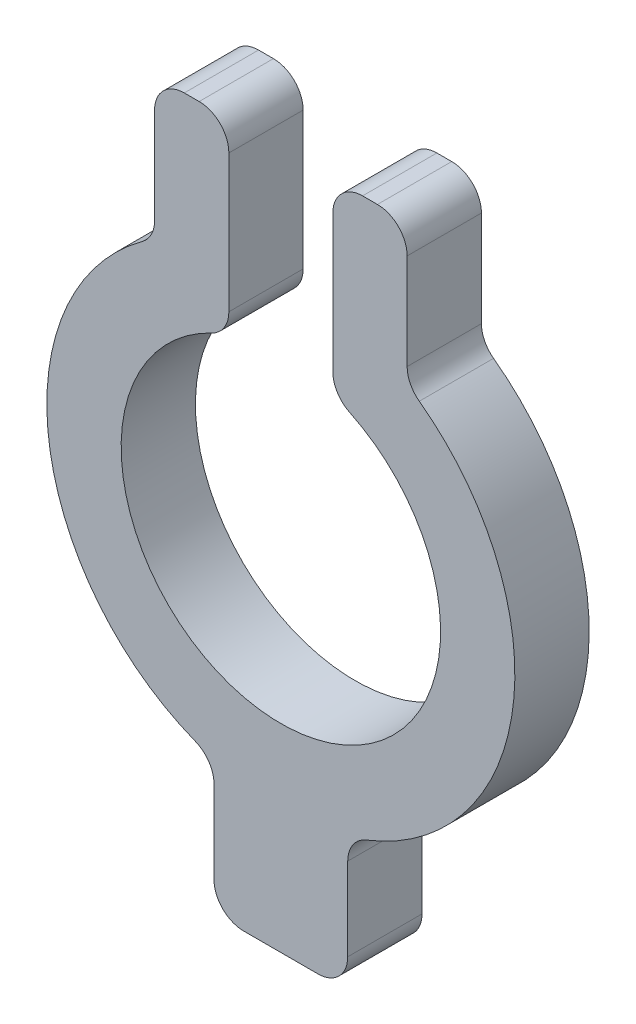
ISO-10303-21;
HEADER;
FILE_DESCRIPTION(('STEP AP214'),'2;1');
FILE_NAME('part.step','',(''),(''),'','','');
FILE_SCHEMA(('AUTOMOTIVE_DESIGN { 1 0 10303 214 1 1 1 1 }'));
ENDSEC;
DATA;
#1=APPLICATION_CONTEXT('core data for automotive mechanical design processes');
#2=APPLICATION_PROTOCOL_DEFINITION('international standard','automotive_design',2000,#1);
#3=PRODUCT_CONTEXT('',#1,'mechanical');
#4=PRODUCT('Part','Part','',(#3));
#5=PRODUCT_RELATED_PRODUCT_CATEGORY('part','',(#4));
#6=PRODUCT_DEFINITION_FORMATION('','',#4);
#7=PRODUCT_DEFINITION_CONTEXT('part definition',#1,'design');
#8=PRODUCT_DEFINITION('design','',#6,#7);
#9=PRODUCT_DEFINITION_SHAPE('','',#8);
#10=(LENGTH_UNIT() NAMED_UNIT(*) SI_UNIT(.MILLI.,.METRE.));
#11=(NAMED_UNIT(*) PLANE_ANGLE_UNIT() SI_UNIT($,.RADIAN.));
#12=(NAMED_UNIT(*) SI_UNIT($,.STERADIAN.) SOLID_ANGLE_UNIT());
#13=UNCERTAINTY_MEASURE_WITH_UNIT(LENGTH_MEASURE(1.E-05),#10,'distance_accuracy_value','');
#14=(GEOMETRIC_REPRESENTATION_CONTEXT(3) GLOBAL_UNCERTAINTY_ASSIGNED_CONTEXT((#13)) GLOBAL_UNIT_ASSIGNED_CONTEXT((#10,
#11,#12)) REPRESENTATION_CONTEXT('',''));
#15=CARTESIAN_POINT('',(0.,0.,0.));
#16=DIRECTION('',(0.,0.,1.));
#17=DIRECTION('',(1.,0.,0.));
#18=AXIS2_PLACEMENT_3D('',#15,#16,#17);
#19=CARTESIAN_POINT('',(0.,0.,5.));
#20=DIRECTION('',(0.,0.,-1.));
#21=DIRECTION('',(-1.,0.,0.));
#22=AXIS2_PLACEMENT_3D('',#19,#20,#21);
#23=CYLINDRICAL_SURFACE('',#22,15.75);
#24=CARTESIAN_POINT('',(0.,0.,5.));
#25=DIRECTION('',(0.,0.,1.));
#26=DIRECTION('',(1.,0.,0.));
#27=AXIS2_PLACEMENT_3D('',#24,#25,#26);
#28=CIRCLE('',#27,15.75);
#29=CARTESIAN_POINT('',(5.76760563380282,-14.6559621060143,5.));
#30=VERTEX_POINT('',#29);
#31=CARTESIAN_POINT('',(9.3169014084507,12.6987341158562,5.));
#32=VERTEX_POINT('',#31);
#33=EDGE_CURVE('E225',#30,#32,#28,.T.);
#34=ORIENTED_EDGE('',*,*,#33,.F.);
#35=DIRECTION('',(0.,0.,-1.));
#36=VECTOR('',#35,1.);
#37=CARTESIAN_POINT('',(5.76760563380282,-14.6559621060143,5.));
#38=LINE('',#37,#36);
#39=CARTESIAN_POINT('',(5.76760563380282,-14.6559621060143,0.));
#40=VERTEX_POINT('',#39);
#41=EDGE_CURVE('E274',#30,#40,#38,.T.);
#42=ORIENTED_EDGE('',*,*,#41,.T.);
#43=CARTESIAN_POINT('',(0.,0.,0.));
#44=DIRECTION('',(0.,0.,1.));
#45=DIRECTION('',(1.,0.,0.));
#46=AXIS2_PLACEMENT_3D('',#43,#44,#45);
#47=CIRCLE('',#46,15.75);
#48=CARTESIAN_POINT('',(9.3169014084507,12.6987341158562,0.));
#49=VERTEX_POINT('',#48);
#50=EDGE_CURVE('E359',#40,#49,#47,.T.);
#51=ORIENTED_EDGE('',*,*,#50,.T.);
#52=DIRECTION('',(0.,0.,-1.));
#53=VECTOR('',#52,1.);
#54=CARTESIAN_POINT('',(9.3169014084507,12.6987341158562,5.));
#55=LINE('',#54,#53);
#56=EDGE_CURVE('E272',#49,#32,#55,.F.);
#57=ORIENTED_EDGE('',*,*,#56,.T.);
#58=EDGE_LOOP('',(#34,#42,#51,#57));
#59=FACE_BOUND('',#58,.T.);
#60=ADVANCED_FACE('F35',(#59),#23,.T.);
#61=CARTESIAN_POINT('',(8.5,13.2594306061761,5.));
#62=DIRECTION('',(-1.,0.,0.));
#63=DIRECTION('',(0.,0.,1.));
#64=AXIS2_PLACEMENT_3D('',#61,#62,#63);
#65=PLANE('',#64);
#66=DIRECTION('',(0.,1.,0.));
#67=VECTOR('',#66,1.);
#68=CARTESIAN_POINT('',(8.5,13.2594306061761,5.));
#69=LINE('',#68,#67);
#70=CARTESIAN_POINT('',(8.5,14.3112717813617,5.));
#71=VERTEX_POINT('',#70);
#72=CARTESIAN_POINT('',(8.5,20.7594306061761,5.));
#73=VERTEX_POINT('',#72);
#74=EDGE_CURVE('E499',#71,#73,#69,.T.);
#75=ORIENTED_EDGE('',*,*,#74,.F.);
#76=DIRECTION('',(0.,0.,1.));
#77=VECTOR('',#76,1.);
#78=CARTESIAN_POINT('',(8.5,14.3112717813617,0.));
#79=LINE('',#78,#77);
#80=CARTESIAN_POINT('',(8.5,14.3112717813617,0.));
#81=VERTEX_POINT('',#80);
#82=EDGE_CURVE('E279',#71,#81,#79,.F.);
#83=ORIENTED_EDGE('',*,*,#82,.T.);
#84=DIRECTION('',(0.,1.,0.));
#85=VECTOR('',#84,1.);
#86=CARTESIAN_POINT('',(8.5,13.2594306061761,0.));
#87=LINE('',#86,#85);
#88=CARTESIAN_POINT('',(8.5,20.7594306061761,0.));
#89=VERTEX_POINT('',#88);
#90=EDGE_CURVE('E362',#81,#89,#87,.T.);
#91=ORIENTED_EDGE('',*,*,#90,.T.);
#92=DIRECTION('',(0.,0.,-1.));
#93=VECTOR('',#92,1.);
#94=CARTESIAN_POINT('',(8.5,20.7594306061761,5.));
#95=LINE('',#94,#93);
#96=EDGE_CURVE('E277',#89,#73,#95,.F.);
#97=ORIENTED_EDGE('',*,*,#96,.T.);
#98=EDGE_LOOP('',(#75,#83,#91,#97));
#99=FACE_BOUND('',#98,.T.);
#100=ADVANCED_FACE('F394',(#99),#65,.F.);
#101=CARTESIAN_POINT('',(3.5,22.7594306061761,5.));
#102=DIRECTION('',(0.,-1.,0.));
#103=DIRECTION('',(0.,0.,-1.));
#104=AXIS2_PLACEMENT_3D('',#101,#102,#103);
#105=PLANE('',#104);
#106=DIRECTION('',(-1.,0.,0.));
#107=VECTOR('',#106,1.);
#108=CARTESIAN_POINT('',(3.5,22.7594306061761,5.));
#109=LINE('',#108,#107);
#110=CARTESIAN_POINT('',(6.5,22.7594306061761,5.));
#111=VERTEX_POINT('',#110);
#112=CARTESIAN_POINT('',(5.5,22.7594306061761,5.));
#113=VERTEX_POINT('',#112);
#114=EDGE_CURVE('E464',#111,#113,#109,.T.);
#115=ORIENTED_EDGE('',*,*,#114,.F.);
#116=DIRECTION('',(0.,0.,-1.));
#117=VECTOR('',#116,1.);
#118=CARTESIAN_POINT('',(6.5,22.7594306061761,5.));
#119=LINE('',#118,#117);
#120=CARTESIAN_POINT('',(6.5,22.7594306061761,0.));
#121=VERTEX_POINT('',#120);
#122=EDGE_CURVE('E284',#111,#121,#119,.T.);
#123=ORIENTED_EDGE('',*,*,#122,.T.);
#124=DIRECTION('',(-1.,0.,0.));
#125=VECTOR('',#124,1.);
#126=CARTESIAN_POINT('',(3.5,22.7594306061761,0.));
#127=LINE('',#126,#125);
#128=CARTESIAN_POINT('',(5.5,22.7594306061761,0.));
#129=VERTEX_POINT('',#128);
#130=EDGE_CURVE('E365',#121,#129,#127,.T.);
#131=ORIENTED_EDGE('',*,*,#130,.T.);
#132=DIRECTION('',(0.,0.,-1.));
#133=VECTOR('',#132,1.);
#134=CARTESIAN_POINT('',(5.5,22.7594306061761,5.));
#135=LINE('',#134,#133);
#136=EDGE_CURVE('E282',#129,#113,#135,.F.);
#137=ORIENTED_EDGE('',*,*,#136,.T.);
#138=EDGE_LOOP('',(#115,#123,#131,#137));
#139=FACE_BOUND('',#138,.T.);
#140=ADVANCED_FACE('F400',(#139),#105,.F.);
#141=CARTESIAN_POINT('',(3.5,10.1642756751281,5.));
#142=DIRECTION('',(1.,0.,0.));
#143=DIRECTION('',(0.,1.,0.));
#144=AXIS2_PLACEMENT_3D('',#141,#142,#143);
#145=PLANE('',#144);
#146=DIRECTION('',(0.,-1.,0.));
#147=VECTOR('',#146,1.);
#148=CARTESIAN_POINT('',(3.5,10.1642756751281,5.));
#149=LINE('',#148,#147);
#150=CARTESIAN_POINT('',(3.5,20.7594306061761,5.));
#151=VERTEX_POINT('',#150);
#152=CARTESIAN_POINT('',(3.5,11.5027170703273,5.));
#153=VERTEX_POINT('',#152);
#154=EDGE_CURVE('E455',#151,#153,#149,.T.);
#155=ORIENTED_EDGE('',*,*,#154,.F.);
#156=DIRECTION('',(0.,0.,-1.));
#157=VECTOR('',#156,1.);
#158=CARTESIAN_POINT('',(3.5,20.7594306061761,5.));
#159=LINE('',#158,#157);
#160=CARTESIAN_POINT('',(3.5,20.7594306061761,0.));
#161=VERTEX_POINT('',#160);
#162=EDGE_CURVE('E289',#151,#161,#159,.T.);
#163=ORIENTED_EDGE('',*,*,#162,.T.);
#164=DIRECTION('',(0.,-1.,0.));
#165=VECTOR('',#164,1.);
#166=CARTESIAN_POINT('',(3.5,10.1642756751281,0.));
#167=LINE('',#166,#165);
#168=CARTESIAN_POINT('',(3.5,11.5027170703273,0.));
#169=VERTEX_POINT('',#168);
#170=EDGE_CURVE('E368',#161,#169,#167,.T.);
#171=ORIENTED_EDGE('',*,*,#170,.T.);
#172=DIRECTION('',(0.,0.,-1.));
#173=VECTOR('',#172,1.);
#174=CARTESIAN_POINT('',(3.5,11.5027170703273,5.));
#175=LINE('',#174,#173);
#176=EDGE_CURVE('E287',#169,#153,#175,.F.);
#177=ORIENTED_EDGE('',*,*,#176,.T.);
#178=EDGE_LOOP('',(#155,#163,#171,#177));
#179=FACE_BOUND('',#178,.T.);
#180=ADVANCED_FACE('F484',(#179),#145,.F.);
#181=CARTESIAN_POINT('',(0.,0.,5.));
#182=DIRECTION('',(0.,0.,-1.));
#183=DIRECTION('',(-1.,0.,0.));
#184=AXIS2_PLACEMENT_3D('',#181,#182,#183);
#185=CYLINDRICAL_SURFACE('',#184,10.75);
#186=CARTESIAN_POINT('',(0.,0.,5.));
#187=DIRECTION('',(0.,0.,-1.));
#188=DIRECTION('',(1.,0.,0.));
#189=AXIS2_PLACEMENT_3D('',#186,#187,#188);
#190=CIRCLE('',#189,10.75);
#191=CARTESIAN_POINT('',(4.63725490196078,9.69836929458972,5.));
#192=VERTEX_POINT('',#191);
#193=CARTESIAN_POINT('',(-4.63725490196078,9.69836929458972,5.));
#194=VERTEX_POINT('',#193);
#195=EDGE_CURVE('E452',#192,#194,#190,.T.);
#196=ORIENTED_EDGE('',*,*,#195,.F.);
#197=DIRECTION('',(0.,0.,-1.));
#198=VECTOR('',#197,1.);
#199=CARTESIAN_POINT('',(4.63725490196078,9.69836929458972,5.));
#200=LINE('',#199,#198);
#201=CARTESIAN_POINT('',(4.63725490196078,9.69836929458972,0.));
#202=VERTEX_POINT('',#201);
#203=EDGE_CURVE('E309',#192,#202,#200,.T.);
#204=ORIENTED_EDGE('',*,*,#203,.T.);
#205=CARTESIAN_POINT('',(0.,0.,0.));
#206=DIRECTION('',(0.,0.,-1.));
#207=DIRECTION('',(1.,0.,0.));
#208=AXIS2_PLACEMENT_3D('',#205,#206,#207);
#209=CIRCLE('',#208,10.75);
#210=CARTESIAN_POINT('',(-4.63725490196078,9.69836929458972,0.));
#211=VERTEX_POINT('',#210);
#212=EDGE_CURVE('E371',#202,#211,#209,.T.);
#213=ORIENTED_EDGE('',*,*,#212,.T.);
#214=DIRECTION('',(0.,0.,-1.));
#215=VECTOR('',#214,1.);
#216=CARTESIAN_POINT('',(-4.63725490196078,9.69836929458972,5.));
#217=LINE('',#216,#215);
#218=EDGE_CURVE('E307',#211,#194,#217,.F.);
#219=ORIENTED_EDGE('',*,*,#218,.T.);
#220=EDGE_LOOP('',(#196,#204,#213,#219));
#221=FACE_BOUND('',#220,.T.);
#222=ADVANCED_FACE('F457',(#221),#185,.F.);
#223=CARTESIAN_POINT('',(-3.5,10.1642756751281,5.));
#224=DIRECTION('',(-1.,0.,0.));
#225=DIRECTION('',(0.,-1.,0.));
#226=AXIS2_PLACEMENT_3D('',#223,#224,#225);
#227=PLANE('',#226);
#228=DIRECTION('',(0.,1.,0.));
#229=VECTOR('',#228,1.);
#230=CARTESIAN_POINT('',(-3.5,10.1642756751281,0.));
#231=LINE('',#230,#229);
#232=CARTESIAN_POINT('',(-3.5,11.5027170703273,0.));
#233=VERTEX_POINT('',#232);
#234=CARTESIAN_POINT('',(-3.5,20.7594306061761,0.));
#235=VERTEX_POINT('',#234);
#236=EDGE_CURVE('E374',#233,#235,#231,.T.);
#237=ORIENTED_EDGE('',*,*,#236,.T.);
#238=DIRECTION('',(0.,0.,-1.));
#239=VECTOR('',#238,1.);
#240=CARTESIAN_POINT('',(-3.5,20.7594306061761,5.));
#241=LINE('',#240,#239);
#242=CARTESIAN_POINT('',(-3.5,20.7594306061761,5.));
#243=VERTEX_POINT('',#242);
#244=EDGE_CURVE('E300',#235,#243,#241,.F.);
#245=ORIENTED_EDGE('',*,*,#244,.T.);
#246=DIRECTION('',(0.,1.,0.));
#247=VECTOR('',#246,1.);
#248=CARTESIAN_POINT('',(-3.5,10.1642756751281,5.));
#249=LINE('',#248,#247);
#250=CARTESIAN_POINT('',(-3.5,11.5027170703273,5.));
#251=VERTEX_POINT('',#250);
#252=EDGE_CURVE('E460',#251,#243,#249,.T.);
#253=ORIENTED_EDGE('',*,*,#252,.F.);
#254=DIRECTION('',(0.,0.,-1.));
#255=VECTOR('',#254,1.);
#256=CARTESIAN_POINT('',(-3.5,11.5027170703273,5.));
#257=LINE('',#256,#255);
#258=EDGE_CURVE('E297',#251,#233,#257,.T.);
#259=ORIENTED_EDGE('',*,*,#258,.T.);
#260=EDGE_LOOP('',(#237,#245,#253,#259));
#261=FACE_BOUND('',#260,.T.);
#262=ADVANCED_FACE('F479',(#261),#227,.F.);
#263=CARTESIAN_POINT('',(-8.5,22.7594306061761,5.));
#264=DIRECTION('',(0.,-1.,0.));
#265=DIRECTION('',(0.,0.,-1.));
#266=AXIS2_PLACEMENT_3D('',#263,#264,#265);
#267=PLANE('',#266);
#268=DIRECTION('',(-1.,0.,0.));
#269=VECTOR('',#268,1.);
#270=CARTESIAN_POINT('',(-8.5,22.7594306061761,5.));
#271=LINE('',#270,#269);
#272=CARTESIAN_POINT('',(-5.5,22.7594306061761,5.));
#273=VERTEX_POINT('',#272);
#274=CARTESIAN_POINT('',(-6.5,22.7594306061761,5.));
#275=VERTEX_POINT('',#274);
#276=EDGE_CURVE('E353',#273,#275,#271,.T.);
#277=ORIENTED_EDGE('',*,*,#276,.F.);
#278=DIRECTION('',(0.,0.,-1.));
#279=VECTOR('',#278,1.);
#280=CARTESIAN_POINT('',(-5.5,22.7594306061761,5.));
#281=LINE('',#280,#279);
#282=CARTESIAN_POINT('',(-5.5,22.7594306061761,0.));
#283=VERTEX_POINT('',#282);
#284=EDGE_CURVE('E294',#273,#283,#281,.T.);
#285=ORIENTED_EDGE('',*,*,#284,.T.);
#286=DIRECTION('',(-1.,0.,0.));
#287=VECTOR('',#286,1.);
#288=CARTESIAN_POINT('',(-8.5,22.7594306061761,0.));
#289=LINE('',#288,#287);
#290=CARTESIAN_POINT('',(-6.5,22.7594306061761,0.));
#291=VERTEX_POINT('',#290);
#292=EDGE_CURVE('E336',#283,#291,#289,.T.);
#293=ORIENTED_EDGE('',*,*,#292,.T.);
#294=DIRECTION('',(0.,0.,-1.));
#295=VECTOR('',#294,1.);
#296=CARTESIAN_POINT('',(-6.5,22.7594306061761,5.));
#297=LINE('',#296,#295);
#298=EDGE_CURVE('E292',#291,#275,#297,.F.);
#299=ORIENTED_EDGE('',*,*,#298,.T.);
#300=EDGE_LOOP('',(#277,#285,#293,#299));
#301=FACE_BOUND('',#300,.T.);
#302=ADVANCED_FACE('F475',(#301),#267,.F.);
#303=CARTESIAN_POINT('',(-8.5,13.2594306061761,5.));
#304=DIRECTION('',(1.,0.,0.));
#305=DIRECTION('',(0.,0.,-1.));
#306=AXIS2_PLACEMENT_3D('',#303,#304,#305);
#307=PLANE('',#306);
#308=DIRECTION('',(0.,-1.,0.));
#309=VECTOR('',#308,1.);
#310=CARTESIAN_POINT('',(-8.5,13.2594306061761,5.));
#311=LINE('',#310,#309);
#312=CARTESIAN_POINT('',(-8.5,20.7594306061761,5.));
#313=VERTEX_POINT('',#312);
#314=CARTESIAN_POINT('',(-8.5,14.3112717813617,5.));
#315=VERTEX_POINT('',#314);
#316=EDGE_CURVE('E346',#313,#315,#311,.T.);
#317=ORIENTED_EDGE('',*,*,#316,.F.);
#318=DIRECTION('',(0.,0.,-1.));
#319=VECTOR('',#318,1.);
#320=CARTESIAN_POINT('',(-8.5,20.7594306061761,5.));
#321=LINE('',#320,#319);
#322=CARTESIAN_POINT('',(-8.5,20.7594306061761,0.));
#323=VERTEX_POINT('',#322);
#324=EDGE_CURVE('E304',#313,#323,#321,.T.);
#325=ORIENTED_EDGE('',*,*,#324,.T.);
#326=DIRECTION('',(0.,-1.,0.));
#327=VECTOR('',#326,1.);
#328=CARTESIAN_POINT('',(-8.5,13.2594306061761,0.));
#329=LINE('',#328,#327);
#330=CARTESIAN_POINT('',(-8.5,14.3112717813617,0.));
#331=VERTEX_POINT('',#330);
#332=EDGE_CURVE('E326',#323,#331,#329,.T.);
#333=ORIENTED_EDGE('',*,*,#332,.T.);
#334=DIRECTION('',(0.,0.,1.));
#335=VECTOR('',#334,1.);
#336=CARTESIAN_POINT('',(-8.5,14.3112717813617,5.));
#337=LINE('',#336,#335);
#338=EDGE_CURVE('E302',#331,#315,#337,.T.);
#339=ORIENTED_EDGE('',*,*,#338,.T.);
#340=EDGE_LOOP('',(#317,#325,#333,#339));
#341=FACE_BOUND('',#340,.T.);
#342=ADVANCED_FACE('F333',(#341),#307,.F.);
#343=CARTESIAN_POINT('',(0.,0.,5.));
#344=DIRECTION('',(0.,0.,-1.));
#345=DIRECTION('',(-1.,0.,0.));
#346=AXIS2_PLACEMENT_3D('',#343,#344,#345);
#347=CYLINDRICAL_SURFACE('',#346,15.75);
#348=CARTESIAN_POINT('',(0.,0.,0.));
#349=DIRECTION('',(0.,0.,1.));
#350=DIRECTION('',(1.,0.,0.));
#351=AXIS2_PLACEMENT_3D('',#348,#349,#350);
#352=CIRCLE('',#351,15.75);
#353=CARTESIAN_POINT('',(-9.3169014084507,12.6987341158562,0.));
#354=VERTEX_POINT('',#353);
#355=CARTESIAN_POINT('',(-5.76760563380282,-14.6559621060143,0.));
#356=VERTEX_POINT('',#355);
#357=EDGE_CURVE('E227',#354,#356,#352,.T.);
#358=ORIENTED_EDGE('',*,*,#357,.T.);
#359=DIRECTION('',(0.,0.,-1.));
#360=VECTOR('',#359,1.);
#361=CARTESIAN_POINT('',(-5.76760563380282,-14.6559621060143,5.));
#362=LINE('',#361,#360);
#363=CARTESIAN_POINT('',(-5.76760563380282,-14.6559621060143,5.));
#364=VERTEX_POINT('',#363);
#365=EDGE_CURVE('E266',#356,#364,#362,.F.);
#366=ORIENTED_EDGE('',*,*,#365,.T.);
#367=CARTESIAN_POINT('',(0.,0.,5.));
#368=DIRECTION('',(0.,0.,1.));
#369=DIRECTION('',(1.,0.,0.));
#370=AXIS2_PLACEMENT_3D('',#367,#368,#369);
#371=CIRCLE('',#370,15.75);
#372=CARTESIAN_POINT('',(-9.3169014084507,12.6987341158562,5.));
#373=VERTEX_POINT('',#372);
#374=EDGE_CURVE('E344',#373,#364,#371,.T.);
#375=ORIENTED_EDGE('',*,*,#374,.F.);
#376=DIRECTION('',(0.,0.,-1.));
#377=VECTOR('',#376,1.);
#378=CARTESIAN_POINT('',(-9.3169014084507,12.6987341158562,5.));
#379=LINE('',#378,#377);
#380=EDGE_CURVE('E263',#373,#354,#379,.T.);
#381=ORIENTED_EDGE('',*,*,#380,.T.);
#382=EDGE_LOOP('',(#358,#366,#375,#381));
#383=FACE_BOUND('',#382,.T.);
#384=ADVANCED_FACE('F348',(#383),#347,.T.);
#385=CARTESIAN_POINT('',(-4.5,-15.0934588481236,5.));
#386=DIRECTION('',(1.,0.,0.));
#387=DIRECTION('',(0.,1.,0.));
#388=AXIS2_PLACEMENT_3D('',#385,#386,#387);
#389=PLANE('',#388);
#390=DIRECTION('',(0.,-1.,0.));
#391=VECTOR('',#390,1.);
#392=CARTESIAN_POINT('',(-4.5,-15.0934588481236,0.));
#393=LINE('',#392,#391);
#394=CARTESIAN_POINT('',(-4.5,-16.5170366591589,0.));
#395=VERTEX_POINT('',#394);
#396=CARTESIAN_POINT('',(-4.5,-22.0934588481236,0.));
#397=VERTEX_POINT('',#396);
#398=EDGE_CURVE('E223',#395,#397,#393,.T.);
#399=ORIENTED_EDGE('',*,*,#398,.T.);
#400=DIRECTION('',(0.,0.,-1.));
#401=VECTOR('',#400,1.);
#402=CARTESIAN_POINT('',(-4.5,-22.0934588481236,5.));
#403=LINE('',#402,#401);
#404=CARTESIAN_POINT('',(-4.5,-22.0934588481236,5.));
#405=VERTEX_POINT('',#404);
#406=EDGE_CURVE('E202',#397,#405,#403,.F.);
#407=ORIENTED_EDGE('',*,*,#406,.T.);
#408=DIRECTION('',(0.,-1.,0.));
#409=VECTOR('',#408,1.);
#410=CARTESIAN_POINT('',(-4.5,-15.0934588481236,5.));
#411=LINE('',#410,#409);
#412=CARTESIAN_POINT('',(-4.5,-16.5170366591589,5.));
#413=VERTEX_POINT('',#412);
#414=EDGE_CURVE('E350',#413,#405,#411,.T.);
#415=ORIENTED_EDGE('',*,*,#414,.F.);
#416=DIRECTION('',(0.,0.,1.));
#417=VECTOR('',#416,1.);
#418=CARTESIAN_POINT('',(-4.5,-16.5170366591589,0.));
#419=LINE('',#418,#417);
#420=EDGE_CURVE('E207',#413,#395,#419,.F.);
#421=ORIENTED_EDGE('',*,*,#420,.T.);
#422=EDGE_LOOP('',(#399,#407,#415,#421));
#423=FACE_BOUND('',#422,.T.);
#424=ADVANCED_FACE('F383',(#423),#389,.F.);
#425=CARTESIAN_POINT('',(-4.5,-24.0934588481236,5.));
#426=DIRECTION('',(0.,1.,0.));
#427=DIRECTION('',(0.,0.,1.));
#428=AXIS2_PLACEMENT_3D('',#425,#426,#427);
#429=PLANE('',#428);
#430=DIRECTION('',(1.,0.,0.));
#431=VECTOR('',#430,1.);
#432=CARTESIAN_POINT('',(-4.5,-24.0934588481236,5.));
#433=LINE('',#432,#431);
#434=CARTESIAN_POINT('',(-2.5,-24.0934588481236,5.));
#435=VERTEX_POINT('',#434);
#436=CARTESIAN_POINT('',(2.5,-24.0934588481236,5.));
#437=VERTEX_POINT('',#436);
#438=EDGE_CURVE('E216',#435,#437,#433,.T.);
#439=ORIENTED_EDGE('',*,*,#438,.F.);
#440=DIRECTION('',(0.,0.,-1.));
#441=VECTOR('',#440,1.);
#442=CARTESIAN_POINT('',(-2.5,-24.0934588481236,5.));
#443=LINE('',#442,#441);
#444=CARTESIAN_POINT('',(-2.5,-24.0934588481236,0.));
#445=VERTEX_POINT('',#444);
#446=EDGE_CURVE('E201',#435,#445,#443,.T.);
#447=ORIENTED_EDGE('',*,*,#446,.T.);
#448=DIRECTION('',(1.,0.,0.));
#449=VECTOR('',#448,1.);
#450=CARTESIAN_POINT('',(-4.5,-24.0934588481236,0.));
#451=LINE('',#450,#449);
#452=CARTESIAN_POINT('',(2.5,-24.0934588481236,0.));
#453=VERTEX_POINT('',#452);
#454=EDGE_CURVE('E214',#445,#453,#451,.T.);
#455=ORIENTED_EDGE('',*,*,#454,.T.);
#456=DIRECTION('',(0.,0.,-1.));
#457=VECTOR('',#456,1.);
#458=CARTESIAN_POINT('',(2.5,-24.0934588481236,5.));
#459=LINE('',#458,#457);
#460=EDGE_CURVE('E218',#453,#437,#459,.F.);
#461=ORIENTED_EDGE('',*,*,#460,.T.);
#462=EDGE_LOOP('',(#439,#447,#455,#461));
#463=FACE_BOUND('',#462,.T.);
#464=ADVANCED_FACE('F213',(#463),#429,.F.);
#465=CARTESIAN_POINT('',(4.5,-15.0934588481236,5.));
#466=DIRECTION('',(-1.,0.,0.));
#467=DIRECTION('',(0.,-1.,0.));
#468=AXIS2_PLACEMENT_3D('',#465,#466,#467);
#469=PLANE('',#468);
#470=DIRECTION('',(0.,1.,0.));
#471=VECTOR('',#470,1.);
#472=CARTESIAN_POINT('',(4.5,-15.0934588481236,5.));
#473=LINE('',#472,#471);
#474=CARTESIAN_POINT('',(4.5,-22.0934588481236,5.));
#475=VERTEX_POINT('',#474);
#476=CARTESIAN_POINT('',(4.5,-16.5170366591589,5.));
#477=VERTEX_POINT('',#476);
#478=EDGE_CURVE('E231',#475,#477,#473,.T.);
#479=ORIENTED_EDGE('',*,*,#478,.F.);
#480=DIRECTION('',(0.,0.,-1.));
#481=VECTOR('',#480,1.);
#482=CARTESIAN_POINT('',(4.5,-22.0934588481236,5.));
#483=LINE('',#482,#481);
#484=CARTESIAN_POINT('',(4.5,-22.0934588481236,0.));
#485=VERTEX_POINT('',#484);
#486=EDGE_CURVE('E269',#475,#485,#483,.T.);
#487=ORIENTED_EDGE('',*,*,#486,.T.);
#488=DIRECTION('',(0.,1.,0.));
#489=VECTOR('',#488,1.);
#490=CARTESIAN_POINT('',(4.5,-15.0934588481236,0.));
#491=LINE('',#490,#489);
#492=CARTESIAN_POINT('',(4.5,-16.5170366591589,0.));
#493=VERTEX_POINT('',#492);
#494=EDGE_CURVE('E222',#485,#493,#491,.T.);
#495=ORIENTED_EDGE('',*,*,#494,.T.);
#496=DIRECTION('',(0.,0.,1.));
#497=VECTOR('',#496,1.);
#498=CARTESIAN_POINT('',(4.5,-16.5170366591589,5.));
#499=LINE('',#498,#497);
#500=EDGE_CURVE('E50',#493,#477,#499,.T.);
#501=ORIENTED_EDGE('',*,*,#500,.T.);
#502=EDGE_LOOP('',(#479,#487,#495,#501));
#503=FACE_BOUND('',#502,.T.);
#504=ADVANCED_FACE('F390',(#503),#469,.F.);
#505=CARTESIAN_POINT('',(0.,0.,5.));
#506=DIRECTION('',(0.,0.,1.));
#507=DIRECTION('',(1.,0.,0.));
#508=AXIS2_PLACEMENT_3D('',#505,#506,#507);
#509=PLANE('',#508);
#510=ORIENTED_EDGE('',*,*,#414,.T.);
#511=CARTESIAN_POINT('',(-2.5,-22.0934588481236,5.));
#512=DIRECTION('',(0.,0.,1.));
#513=DIRECTION('',(1.,0.,0.));
#514=AXIS2_PLACEMENT_3D('',#511,#512,#513);
#515=CIRCLE('',#514,2.);
#516=EDGE_CURVE('E261',#405,#435,#515,.T.);
#517=ORIENTED_EDGE('',*,*,#516,.T.);
#518=ORIENTED_EDGE('',*,*,#438,.T.);
#519=CARTESIAN_POINT('',(2.5,-22.0934588481236,5.));
#520=DIRECTION('',(0.,0.,1.));
#521=DIRECTION('',(1.,0.,0.));
#522=AXIS2_PLACEMENT_3D('',#519,#520,#521);
#523=CIRCLE('',#522,2.);
#524=EDGE_CURVE('E57',#437,#475,#523,.T.);
#525=ORIENTED_EDGE('',*,*,#524,.T.);
#526=ORIENTED_EDGE('',*,*,#478,.T.);
#527=CARTESIAN_POINT('',(6.5,-16.5170366591589,5.));
#528=DIRECTION('',(0.,0.,1.));
#529=DIRECTION('',(1.,0.,0.));
#530=AXIS2_PLACEMENT_3D('',#527,#528,#529);
#531=CIRCLE('',#530,2.);
#532=EDGE_CURVE('E318',#477,#30,#531,.F.);
#533=ORIENTED_EDGE('',*,*,#532,.T.);
#534=ORIENTED_EDGE('',*,*,#33,.T.);
#535=CARTESIAN_POINT('',(10.5,14.3112717813617,5.));
#536=DIRECTION('',(0.,0.,1.));
#537=DIRECTION('',(1.,0.,0.));
#538=AXIS2_PLACEMENT_3D('',#535,#536,#537);
#539=CIRCLE('',#538,2.);
#540=EDGE_CURVE('E322',#32,#71,#539,.F.);
#541=ORIENTED_EDGE('',*,*,#540,.T.);
#542=ORIENTED_EDGE('',*,*,#74,.T.);
#543=CARTESIAN_POINT('',(6.5,20.7594306061761,5.));
#544=DIRECTION('',(0.,0.,1.));
#545=DIRECTION('',(1.,0.,0.));
#546=AXIS2_PLACEMENT_3D('',#543,#544,#545);
#547=CIRCLE('',#546,2.);
#548=EDGE_CURVE('E258',#73,#111,#547,.T.);
#549=ORIENTED_EDGE('',*,*,#548,.T.);
#550=ORIENTED_EDGE('',*,*,#114,.T.);
#551=CARTESIAN_POINT('',(5.5,20.7594306061761,5.));
#552=DIRECTION('',(0.,0.,1.));
#553=DIRECTION('',(1.,0.,0.));
#554=AXIS2_PLACEMENT_3D('',#551,#552,#553);
#555=CIRCLE('',#554,2.);
#556=EDGE_CURVE('E256',#113,#151,#555,.T.);
#557=ORIENTED_EDGE('',*,*,#556,.T.);
#558=ORIENTED_EDGE('',*,*,#154,.T.);
#559=CARTESIAN_POINT('',(5.5,11.5027170703273,5.));
#560=DIRECTION('',(0.,0.,1.));
#561=DIRECTION('',(1.,0.,0.));
#562=AXIS2_PLACEMENT_3D('',#559,#560,#561);
#563=CIRCLE('',#562,2.);
#564=EDGE_CURVE('E250',#153,#192,#563,.T.);
#565=ORIENTED_EDGE('',*,*,#564,.T.);
#566=ORIENTED_EDGE('',*,*,#195,.T.);
#567=CARTESIAN_POINT('',(-5.5,11.5027170703273,5.));
#568=DIRECTION('',(0.,0.,1.));
#569=DIRECTION('',(1.,0.,0.));
#570=AXIS2_PLACEMENT_3D('',#567,#568,#569);
#571=CIRCLE('',#570,2.);
#572=EDGE_CURVE('E248',#194,#251,#571,.T.);
#573=ORIENTED_EDGE('',*,*,#572,.T.);
#574=ORIENTED_EDGE('',*,*,#252,.T.);
#575=CARTESIAN_POINT('',(-5.5,20.7594306061761,5.));
#576=DIRECTION('',(0.,0.,1.));
#577=DIRECTION('',(1.,0.,0.));
#578=AXIS2_PLACEMENT_3D('',#575,#576,#577);
#579=CIRCLE('',#578,2.);
#580=EDGE_CURVE('E254',#243,#273,#579,.T.);
#581=ORIENTED_EDGE('',*,*,#580,.T.);
#582=ORIENTED_EDGE('',*,*,#276,.T.);
#583=CARTESIAN_POINT('',(-6.5,20.7594306061761,5.));
#584=DIRECTION('',(0.,0.,1.));
#585=DIRECTION('',(1.,0.,0.));
#586=AXIS2_PLACEMENT_3D('',#583,#584,#585);
#587=CIRCLE('',#586,2.);
#588=EDGE_CURVE('E252',#275,#313,#587,.T.);
#589=ORIENTED_EDGE('',*,*,#588,.T.);
#590=ORIENTED_EDGE('',*,*,#316,.T.);
#591=CARTESIAN_POINT('',(-10.5,14.3112717813617,5.));
#592=DIRECTION('',(0.,0.,1.));
#593=DIRECTION('',(1.,0.,0.));
#594=AXIS2_PLACEMENT_3D('',#591,#592,#593);
#595=CIRCLE('',#594,2.);
#596=EDGE_CURVE('E11',#315,#373,#595,.F.);
#597=ORIENTED_EDGE('',*,*,#596,.T.);
#598=ORIENTED_EDGE('',*,*,#374,.T.);
#599=CARTESIAN_POINT('',(-6.5,-16.5170366591589,5.));
#600=DIRECTION('',(0.,0.,1.));
#601=DIRECTION('',(1.,0.,0.));
#602=AXIS2_PLACEMENT_3D('',#599,#600,#601);
#603=CIRCLE('',#602,2.);
#604=EDGE_CURVE('E314',#364,#413,#603,.F.);
#605=ORIENTED_EDGE('',*,*,#604,.T.);
#606=EDGE_LOOP('',(#510,#517,#518,#525,#526,#533,#534,#541,#542,#549,#550,#557,#558,#565,#566,
#573,#574,#581,#582,#589,#590,#597,#598,#605));
#607=FACE_BOUND('',#606,.T.);
#608=ADVANCED_FACE('F343',(#607),#509,.T.);
#609=CARTESIAN_POINT('',(0.,0.,0.));
#610=DIRECTION('',(0.,0.,1.));
#611=DIRECTION('',(1.,0.,0.));
#612=AXIS2_PLACEMENT_3D('',#609,#610,#611);
#613=PLANE('',#612);
#614=ORIENTED_EDGE('',*,*,#454,.F.);
#615=CARTESIAN_POINT('',(-2.5,-22.0934588481236,0.));
#616=DIRECTION('',(0.,0.,1.));
#617=DIRECTION('',(1.,0.,0.));
#618=AXIS2_PLACEMENT_3D('',#615,#616,#617);
#619=CIRCLE('',#618,2.);
#620=EDGE_CURVE('E197',#445,#397,#619,.F.);
#621=ORIENTED_EDGE('',*,*,#620,.T.);
#622=ORIENTED_EDGE('',*,*,#398,.F.);
#623=CARTESIAN_POINT('',(-6.5,-16.5170366591589,0.));
#624=DIRECTION('',(0.,0.,1.));
#625=DIRECTION('',(1.,0.,0.));
#626=AXIS2_PLACEMENT_3D('',#623,#624,#625);
#627=CIRCLE('',#626,2.);
#628=EDGE_CURVE('E312',#395,#356,#627,.T.);
#629=ORIENTED_EDGE('',*,*,#628,.T.);
#630=ORIENTED_EDGE('',*,*,#357,.F.);
#631=CARTESIAN_POINT('',(-10.5,14.3112717813617,0.));
#632=DIRECTION('',(0.,0.,1.));
#633=DIRECTION('',(1.,0.,0.));
#634=AXIS2_PLACEMENT_3D('',#631,#632,#633);
#635=CIRCLE('',#634,2.);
#636=EDGE_CURVE('E43',#354,#331,#635,.T.);
#637=ORIENTED_EDGE('',*,*,#636,.T.);
#638=ORIENTED_EDGE('',*,*,#332,.F.);
#639=CARTESIAN_POINT('',(-6.5,20.7594306061761,0.));
#640=DIRECTION('',(0.,0.,1.));
#641=DIRECTION('',(1.,0.,0.));
#642=AXIS2_PLACEMENT_3D('',#639,#640,#641);
#643=CIRCLE('',#642,2.);
#644=EDGE_CURVE('E236',#323,#291,#643,.F.);
#645=ORIENTED_EDGE('',*,*,#644,.T.);
#646=ORIENTED_EDGE('',*,*,#292,.F.);
#647=CARTESIAN_POINT('',(-5.5,20.7594306061761,0.));
#648=DIRECTION('',(0.,0.,1.));
#649=DIRECTION('',(1.,0.,0.));
#650=AXIS2_PLACEMENT_3D('',#647,#648,#649);
#651=CIRCLE('',#650,2.);
#652=EDGE_CURVE('E238',#283,#235,#651,.F.);
#653=ORIENTED_EDGE('',*,*,#652,.T.);
#654=ORIENTED_EDGE('',*,*,#236,.F.);
#655=CARTESIAN_POINT('',(-5.5,11.5027170703273,0.));
#656=DIRECTION('',(0.,0.,1.));
#657=DIRECTION('',(1.,0.,0.));
#658=AXIS2_PLACEMENT_3D('',#655,#656,#657);
#659=CIRCLE('',#658,2.);
#660=EDGE_CURVE('E217',#233,#211,#659,.F.);
#661=ORIENTED_EDGE('',*,*,#660,.T.);
#662=ORIENTED_EDGE('',*,*,#212,.F.);
#663=CARTESIAN_POINT('',(5.5,11.5027170703273,0.));
#664=DIRECTION('',(0.,0.,1.));
#665=DIRECTION('',(1.,0.,0.));
#666=AXIS2_PLACEMENT_3D('',#663,#664,#665);
#667=CIRCLE('',#666,2.);
#668=EDGE_CURVE('E234',#202,#169,#667,.F.);
#669=ORIENTED_EDGE('',*,*,#668,.T.);
#670=ORIENTED_EDGE('',*,*,#170,.F.);
#671=CARTESIAN_POINT('',(5.5,20.7594306061761,0.));
#672=DIRECTION('',(0.,0.,1.));
#673=DIRECTION('',(1.,0.,0.));
#674=AXIS2_PLACEMENT_3D('',#671,#672,#673);
#675=CIRCLE('',#674,2.);
#676=EDGE_CURVE('E240',#161,#129,#675,.F.);
#677=ORIENTED_EDGE('',*,*,#676,.T.);
#678=ORIENTED_EDGE('',*,*,#130,.F.);
#679=CARTESIAN_POINT('',(6.5,20.7594306061761,0.));
#680=DIRECTION('',(0.,0.,1.));
#681=DIRECTION('',(1.,0.,0.));
#682=AXIS2_PLACEMENT_3D('',#679,#680,#681);
#683=CIRCLE('',#682,2.);
#684=EDGE_CURVE('E242',#121,#89,#683,.F.);
#685=ORIENTED_EDGE('',*,*,#684,.T.);
#686=ORIENTED_EDGE('',*,*,#90,.F.);
#687=CARTESIAN_POINT('',(10.5,14.3112717813617,0.));
#688=DIRECTION('',(0.,0.,1.));
#689=DIRECTION('',(1.,0.,0.));
#690=AXIS2_PLACEMENT_3D('',#687,#688,#689);
#691=CIRCLE('',#690,2.);
#692=EDGE_CURVE('E320',#81,#49,#691,.T.);
#693=ORIENTED_EDGE('',*,*,#692,.T.);
#694=ORIENTED_EDGE('',*,*,#50,.F.);
#695=CARTESIAN_POINT('',(6.5,-16.5170366591589,0.));
#696=DIRECTION('',(0.,0.,1.));
#697=DIRECTION('',(1.,0.,0.));
#698=AXIS2_PLACEMENT_3D('',#695,#696,#697);
#699=CIRCLE('',#698,2.);
#700=EDGE_CURVE('E316',#40,#493,#699,.T.);
#701=ORIENTED_EDGE('',*,*,#700,.T.);
#702=ORIENTED_EDGE('',*,*,#494,.F.);
#703=CARTESIAN_POINT('',(2.5,-22.0934588481236,0.));
#704=DIRECTION('',(0.,0.,1.));
#705=DIRECTION('',(1.,0.,0.));
#706=AXIS2_PLACEMENT_3D('',#703,#704,#705);
#707=CIRCLE('',#706,2.);
#708=EDGE_CURVE('E208',#485,#453,#707,.F.);
#709=ORIENTED_EDGE('',*,*,#708,.T.);
#710=EDGE_LOOP('',(#614,#621,#622,#629,#630,#637,#638,#645,#646,#653,#654,#661,#662,#669,#670,
#677,#678,#685,#686,#693,#694,#701,#702,#709));
#711=FACE_BOUND('',#710,.T.);
#712=ADVANCED_FACE('F220',(#711),#613,.F.);
#713=CARTESIAN_POINT('',(-2.5,-22.0934588481236,5.));
#714=DIRECTION('',(0.,0.,-1.));
#715=DIRECTION('',(-1.,0.,0.));
#716=AXIS2_PLACEMENT_3D('',#713,#714,#715);
#717=CYLINDRICAL_SURFACE('',#716,2.);
#718=ORIENTED_EDGE('',*,*,#516,.F.);
#719=ORIENTED_EDGE('',*,*,#406,.F.);
#720=ORIENTED_EDGE('',*,*,#620,.F.);
#721=ORIENTED_EDGE('',*,*,#446,.F.);
#722=EDGE_LOOP('',(#718,#719,#720,#721));
#723=FACE_BOUND('',#722,.T.);
#724=ADVANCED_FACE('F200',(#723),#717,.T.);
#725=CARTESIAN_POINT('',(-6.5,-16.5170366591589,5.));
#726=DIRECTION('',(0.,0.,-1.));
#727=DIRECTION('',(-1.,0.,0.));
#728=AXIS2_PLACEMENT_3D('',#725,#726,#727);
#729=CYLINDRICAL_SURFACE('',#728,2.);
#730=ORIENTED_EDGE('',*,*,#604,.F.);
#731=ORIENTED_EDGE('',*,*,#365,.F.);
#732=ORIENTED_EDGE('',*,*,#628,.F.);
#733=ORIENTED_EDGE('',*,*,#420,.F.);
#734=EDGE_LOOP('',(#730,#731,#732,#733));
#735=FACE_BOUND('',#734,.T.);
#736=ADVANCED_FACE('F379',(#735),#729,.F.);
#737=CARTESIAN_POINT('',(2.5,-22.0934588481236,5.));
#738=DIRECTION('',(0.,0.,-1.));
#739=DIRECTION('',(-1.,0.,0.));
#740=AXIS2_PLACEMENT_3D('',#737,#738,#739);
#741=CYLINDRICAL_SURFACE('',#740,2.);
#742=ORIENTED_EDGE('',*,*,#524,.F.);
#743=ORIENTED_EDGE('',*,*,#460,.F.);
#744=ORIENTED_EDGE('',*,*,#708,.F.);
#745=ORIENTED_EDGE('',*,*,#486,.F.);
#746=EDGE_LOOP('',(#742,#743,#744,#745));
#747=FACE_BOUND('',#746,.T.);
#748=ADVANCED_FACE('F410',(#747),#741,.T.);
#749=CARTESIAN_POINT('',(6.5,-16.5170366591589,5.));
#750=DIRECTION('',(0.,0.,-1.));
#751=DIRECTION('',(-1.,0.,0.));
#752=AXIS2_PLACEMENT_3D('',#749,#750,#751);
#753=CYLINDRICAL_SURFACE('',#752,2.);
#754=ORIENTED_EDGE('',*,*,#532,.F.);
#755=ORIENTED_EDGE('',*,*,#500,.F.);
#756=ORIENTED_EDGE('',*,*,#700,.F.);
#757=ORIENTED_EDGE('',*,*,#41,.F.);
#758=EDGE_LOOP('',(#754,#755,#756,#757));
#759=FACE_BOUND('',#758,.T.);
#760=ADVANCED_FACE('F413',(#759),#753,.F.);
#761=CARTESIAN_POINT('',(10.5,14.3112717813617,5.));
#762=DIRECTION('',(0.,0.,-1.));
#763=DIRECTION('',(-1.,0.,0.));
#764=AXIS2_PLACEMENT_3D('',#761,#762,#763);
#765=CYLINDRICAL_SURFACE('',#764,2.);
#766=ORIENTED_EDGE('',*,*,#540,.F.);
#767=ORIENTED_EDGE('',*,*,#56,.F.);
#768=ORIENTED_EDGE('',*,*,#692,.F.);
#769=ORIENTED_EDGE('',*,*,#82,.F.);
#770=EDGE_LOOP('',(#766,#767,#768,#769));
#771=FACE_BOUND('',#770,.T.);
#772=ADVANCED_FACE('F417',(#771),#765,.F.);
#773=CARTESIAN_POINT('',(6.5,20.7594306061761,5.));
#774=DIRECTION('',(0.,0.,-1.));
#775=DIRECTION('',(-1.,0.,0.));
#776=AXIS2_PLACEMENT_3D('',#773,#774,#775);
#777=CYLINDRICAL_SURFACE('',#776,2.);
#778=ORIENTED_EDGE('',*,*,#548,.F.);
#779=ORIENTED_EDGE('',*,*,#96,.F.);
#780=ORIENTED_EDGE('',*,*,#684,.F.);
#781=ORIENTED_EDGE('',*,*,#122,.F.);
#782=EDGE_LOOP('',(#778,#779,#780,#781));
#783=FACE_BOUND('',#782,.T.);
#784=ADVANCED_FACE('F421',(#783),#777,.T.);
#785=CARTESIAN_POINT('',(5.5,20.7594306061761,5.));
#786=DIRECTION('',(0.,0.,-1.));
#787=DIRECTION('',(-1.,0.,0.));
#788=AXIS2_PLACEMENT_3D('',#785,#786,#787);
#789=CYLINDRICAL_SURFACE('',#788,2.);
#790=ORIENTED_EDGE('',*,*,#556,.F.);
#791=ORIENTED_EDGE('',*,*,#136,.F.);
#792=ORIENTED_EDGE('',*,*,#676,.F.);
#793=ORIENTED_EDGE('',*,*,#162,.F.);
#794=EDGE_LOOP('',(#790,#791,#792,#793));
#795=FACE_BOUND('',#794,.T.);
#796=ADVANCED_FACE('F425',(#795),#789,.T.);
#797=CARTESIAN_POINT('',(-5.5,20.7594306061761,5.));
#798=DIRECTION('',(0.,0.,-1.));
#799=DIRECTION('',(-1.,0.,0.));
#800=AXIS2_PLACEMENT_3D('',#797,#798,#799);
#801=CYLINDRICAL_SURFACE('',#800,2.);
#802=ORIENTED_EDGE('',*,*,#580,.F.);
#803=ORIENTED_EDGE('',*,*,#244,.F.);
#804=ORIENTED_EDGE('',*,*,#652,.F.);
#805=ORIENTED_EDGE('',*,*,#284,.F.);
#806=EDGE_LOOP('',(#802,#803,#804,#805));
#807=FACE_BOUND('',#806,.T.);
#808=ADVANCED_FACE('F429',(#807),#801,.T.);
#809=CARTESIAN_POINT('',(-6.5,20.7594306061761,5.));
#810=DIRECTION('',(0.,0.,-1.));
#811=DIRECTION('',(-1.,0.,0.));
#812=AXIS2_PLACEMENT_3D('',#809,#810,#811);
#813=CYLINDRICAL_SURFACE('',#812,2.);
#814=ORIENTED_EDGE('',*,*,#588,.F.);
#815=ORIENTED_EDGE('',*,*,#298,.F.);
#816=ORIENTED_EDGE('',*,*,#644,.F.);
#817=ORIENTED_EDGE('',*,*,#324,.F.);
#818=EDGE_LOOP('',(#814,#815,#816,#817));
#819=FACE_BOUND('',#818,.T.);
#820=ADVANCED_FACE('F433',(#819),#813,.T.);
#821=CARTESIAN_POINT('',(-10.5,14.3112717813617,5.));
#822=DIRECTION('',(0.,0.,-1.));
#823=DIRECTION('',(-1.,0.,0.));
#824=AXIS2_PLACEMENT_3D('',#821,#822,#823);
#825=CYLINDRICAL_SURFACE('',#824,2.);
#826=ORIENTED_EDGE('',*,*,#596,.F.);
#827=ORIENTED_EDGE('',*,*,#338,.F.);
#828=ORIENTED_EDGE('',*,*,#636,.F.);
#829=ORIENTED_EDGE('',*,*,#380,.F.);
#830=EDGE_LOOP('',(#826,#827,#828,#829));
#831=FACE_BOUND('',#830,.T.);
#832=ADVANCED_FACE('F339',(#831),#825,.F.);
#833=CARTESIAN_POINT('',(5.5,11.5027170703273,5.));
#834=DIRECTION('',(0.,0.,-1.));
#835=DIRECTION('',(-1.,0.,0.));
#836=AXIS2_PLACEMENT_3D('',#833,#834,#835);
#837=CYLINDRICAL_SURFACE('',#836,2.);
#838=ORIENTED_EDGE('',*,*,#564,.F.);
#839=ORIENTED_EDGE('',*,*,#176,.F.);
#840=ORIENTED_EDGE('',*,*,#668,.F.);
#841=ORIENTED_EDGE('',*,*,#203,.F.);
#842=EDGE_LOOP('',(#838,#839,#840,#841));
#843=FACE_BOUND('',#842,.T.);
#844=ADVANCED_FACE('F439',(#843),#837,.T.);
#845=CARTESIAN_POINT('',(-5.5,11.5027170703273,5.));
#846=DIRECTION('',(0.,0.,-1.));
#847=DIRECTION('',(-1.,0.,0.));
#848=AXIS2_PLACEMENT_3D('',#845,#846,#847);
#849=CYLINDRICAL_SURFACE('',#848,2.);
#850=ORIENTED_EDGE('',*,*,#572,.F.);
#851=ORIENTED_EDGE('',*,*,#218,.F.);
#852=ORIENTED_EDGE('',*,*,#660,.F.);
#853=ORIENTED_EDGE('',*,*,#258,.F.);
#854=EDGE_LOOP('',(#850,#851,#852,#853));
#855=FACE_BOUND('',#854,.T.);
#856=ADVANCED_FACE('F37',(#855),#849,.T.);
#857=CLOSED_SHELL('',(#60,#100,#140,#180,#222,#262,#302,#342,#384,#424,#464,#504,#608,#712,#724,
#736,#748,#760,#772,#784,#796,#808,#820,#832,#844,#856));
#858=MANIFOLD_SOLID_BREP('B2',#857);
#859=ADVANCED_BREP_SHAPE_REPRESENTATION('',(#18,#858),#14);
#860=SHAPE_DEFINITION_REPRESENTATION(#9,#859);
ENDSEC;
END-ISO-10303-21;
